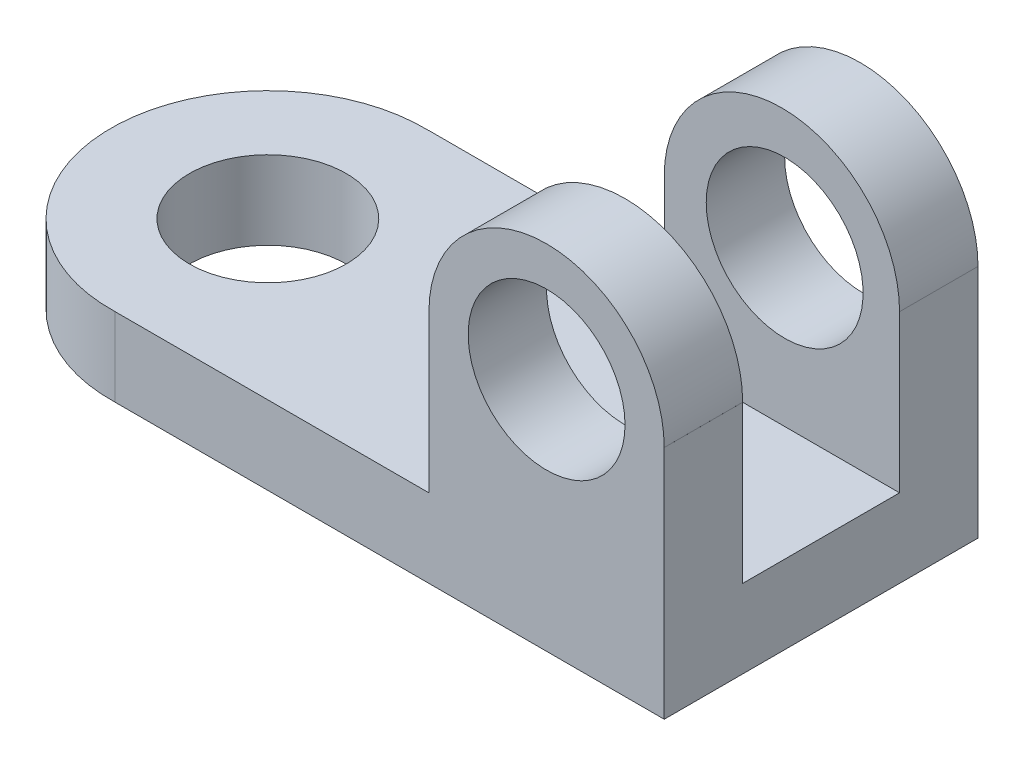
ISO-10303-21;
HEADER;
FILE_DESCRIPTION(('STEP AP214'),'2;1');
FILE_NAME('part.step','',(''),(''),'','','');
FILE_SCHEMA(('AUTOMOTIVE_DESIGN { 1 0 10303 214 1 1 1 1 }'));
ENDSEC;
DATA;
#1=APPLICATION_CONTEXT('core data for automotive mechanical design processes');
#2=APPLICATION_PROTOCOL_DEFINITION('international standard','automotive_design',2000,#1);
#3=PRODUCT_CONTEXT('',#1,'mechanical');
#4=PRODUCT('Part','Part','',(#3));
#5=PRODUCT_RELATED_PRODUCT_CATEGORY('part','',(#4));
#6=PRODUCT_DEFINITION_FORMATION('','',#4);
#7=PRODUCT_DEFINITION_CONTEXT('part definition',#1,'design');
#8=PRODUCT_DEFINITION('design','',#6,#7);
#9=PRODUCT_DEFINITION_SHAPE('','',#8);
#10=(LENGTH_UNIT() NAMED_UNIT(*) SI_UNIT(.MILLI.,.METRE.));
#11=(NAMED_UNIT(*) PLANE_ANGLE_UNIT() SI_UNIT($,.RADIAN.));
#12=(NAMED_UNIT(*) SI_UNIT($,.STERADIAN.) SOLID_ANGLE_UNIT());
#13=UNCERTAINTY_MEASURE_WITH_UNIT(LENGTH_MEASURE(1.E-05),#10,'distance_accuracy_value','');
#14=(GEOMETRIC_REPRESENTATION_CONTEXT(3) GLOBAL_UNCERTAINTY_ASSIGNED_CONTEXT((#13)) GLOBAL_UNIT_ASSIGNED_CONTEXT((#10,
#11,#12)) REPRESENTATION_CONTEXT('',''));
#15=CARTESIAN_POINT('',(0.,0.,0.));
#16=DIRECTION('',(0.,0.,1.));
#17=DIRECTION('',(1.,0.,0.));
#18=AXIS2_PLACEMENT_3D('',#15,#16,#17);
#19=CARTESIAN_POINT('',(0.,12.7,0.));
#20=DIRECTION('',(0.,0.,-1.));
#21=DIRECTION('',(-1.,0.,0.));
#22=AXIS2_PLACEMENT_3D('',#19,#20,#21);
#23=PLANE('',#22);
#24=CARTESIAN_POINT('',(-19.05,38.1,0.));
#25=DIRECTION('',(0.,0.,1.));
#26=DIRECTION('',(1.,0.,0.));
#27=AXIS2_PLACEMENT_3D('',#24,#25,#26);
#28=CIRCLE('',#27,12.7);
#29=CARTESIAN_POINT('',(-6.35000000000001,38.1,0.));
#30=VERTEX_POINT('',#29);
#31=EDGE_CURVE('E167',#30,#30,#28,.T.);
#32=ORIENTED_EDGE('',*,*,#31,.F.);
#33=EDGE_LOOP('',(#32));
#34=FACE_BOUND('',#33,.T.);
#35=DIRECTION('',(1.,0.,0.));
#36=VECTOR('',#35,1.);
#37=CARTESIAN_POINT('',(0.,0.,0.));
#38=LINE('',#37,#36);
#39=CARTESIAN_POINT('',(-88.9,0.,0.));
#40=VERTEX_POINT('',#39);
#41=CARTESIAN_POINT('',(0.,0.,0.));
#42=VERTEX_POINT('',#41);
#43=EDGE_CURVE('E207',#40,#42,#38,.T.);
#44=ORIENTED_EDGE('',*,*,#43,.T.);
#45=DIRECTION('',(0.,-1.,0.));
#46=VECTOR('',#45,1.);
#47=CARTESIAN_POINT('',(0.,12.7,0.));
#48=LINE('',#47,#46);
#49=CARTESIAN_POINT('',(0.,38.1,0.));
#50=VERTEX_POINT('',#49);
#51=EDGE_CURVE('E11',#50,#42,#48,.T.);
#52=ORIENTED_EDGE('',*,*,#51,.F.);
#53=DIRECTION('',(-1.,0.,0.));
#54=VECTOR('',#53,1.);
#55=CARTESIAN_POINT('',(-0.0026166621601674,38.1,0.));
#56=LINE('',#55,#54);
#57=CARTESIAN_POINT('',(-0.0026166621601674,38.1,0.));
#58=VERTEX_POINT('',#57);
#59=EDGE_CURVE('E173',#50,#58,#56,.T.);
#60=ORIENTED_EDGE('',*,*,#59,.T.);
#61=CARTESIAN_POINT('',(-19.05,38.1,0.));
#62=DIRECTION('',(0.,0.,1.));
#63=DIRECTION('',(1.,0.,0.));
#64=AXIS2_PLACEMENT_3D('',#61,#62,#63);
#65=CIRCLE('',#64,19.0473833378398);
#66=CARTESIAN_POINT('',(-38.0973833378399,38.1,0.));
#67=VERTEX_POINT('',#66);
#68=EDGE_CURVE('E197',#58,#67,#65,.T.);
#69=ORIENTED_EDGE('',*,*,#68,.T.);
#70=DIRECTION('',(-1.,0.,0.));
#71=VECTOR('',#70,1.);
#72=CARTESIAN_POINT('',(-38.1,38.1,0.));
#73=LINE('',#72,#71);
#74=CARTESIAN_POINT('',(-38.1,38.1,0.));
#75=VERTEX_POINT('',#74);
#76=EDGE_CURVE('E200',#67,#75,#73,.T.);
#77=ORIENTED_EDGE('',*,*,#76,.T.);
#78=DIRECTION('',(0.,-1.,0.));
#79=VECTOR('',#78,1.);
#80=CARTESIAN_POINT('',(-38.1,12.7,0.));
#81=LINE('',#80,#79);
#82=CARTESIAN_POINT('',(-38.1,12.7,0.));
#83=VERTEX_POINT('',#82);
#84=EDGE_CURVE('E179',#75,#83,#81,.T.);
#85=ORIENTED_EDGE('',*,*,#84,.T.);
#86=DIRECTION('',(1.,0.,0.));
#87=VECTOR('',#86,1.);
#88=CARTESIAN_POINT('',(0.,12.7,0.));
#89=LINE('',#88,#87);
#90=CARTESIAN_POINT('',(-88.9,12.7,0.));
#91=VERTEX_POINT('',#90);
#92=EDGE_CURVE('E216',#91,#83,#89,.T.);
#93=ORIENTED_EDGE('',*,*,#92,.F.);
#94=DIRECTION('',(0.,-1.,0.));
#95=VECTOR('',#94,1.);
#96=CARTESIAN_POINT('',(-88.9,12.7,0.));
#97=LINE('',#96,#95);
#98=EDGE_CURVE('E227',#91,#40,#97,.T.);
#99=ORIENTED_EDGE('',*,*,#98,.T.);
#100=EDGE_LOOP('',(#44,#52,#60,#69,#77,#85,#93,#99));
#101=FACE_BOUND('',#100,.T.);
#102=ADVANCED_FACE('F39',(#34,#101),#23,.F.);
#103=CARTESIAN_POINT('',(0.,12.7,0.));
#104=DIRECTION('',(-1.,0.,0.));
#105=DIRECTION('',(0.,0.,1.));
#106=AXIS2_PLACEMENT_3D('',#103,#104,#105);
#107=PLANE('',#106);
#108=DIRECTION('',(0.,0.,-1.));
#109=VECTOR('',#108,1.);
#110=CARTESIAN_POINT('',(0.,0.,0.));
#111=LINE('',#110,#109);
#112=CARTESIAN_POINT('',(0.,0.,-50.8));
#113=VERTEX_POINT('',#112);
#114=EDGE_CURVE('E230',#42,#113,#111,.T.);
#115=ORIENTED_EDGE('',*,*,#114,.T.);
#116=DIRECTION('',(0.,-1.,0.));
#117=VECTOR('',#116,1.);
#118=CARTESIAN_POINT('',(0.,12.7,-50.8));
#119=LINE('',#118,#117);
#120=CARTESIAN_POINT('',(0.,38.1,-50.8));
#121=VERTEX_POINT('',#120);
#122=EDGE_CURVE('E47',#121,#113,#119,.T.);
#123=ORIENTED_EDGE('',*,*,#122,.F.);
#124=DIRECTION('',(0.,0.,-1.));
#125=VECTOR('',#124,1.);
#126=CARTESIAN_POINT('',(0.,38.1,-38.1));
#127=LINE('',#126,#125);
#128=CARTESIAN_POINT('',(0.,38.1,-38.1));
#129=VERTEX_POINT('',#128);
#130=EDGE_CURVE('E147',#129,#121,#127,.T.);
#131=ORIENTED_EDGE('',*,*,#130,.F.);
#132=DIRECTION('',(0.,-1.,0.));
#133=VECTOR('',#132,1.);
#134=CARTESIAN_POINT('',(0.,38.1,-38.1));
#135=LINE('',#134,#133);
#136=CARTESIAN_POINT('',(0.,12.7,-38.1));
#137=VERTEX_POINT('',#136);
#138=EDGE_CURVE('E155',#129,#137,#135,.T.);
#139=ORIENTED_EDGE('',*,*,#138,.T.);
#140=DIRECTION('',(0.,0.,-1.));
#141=VECTOR('',#140,1.);
#142=CARTESIAN_POINT('',(0.,12.7,0.));
#143=LINE('',#142,#141);
#144=CARTESIAN_POINT('',(0.,12.7,-12.7));
#145=VERTEX_POINT('',#144);
#146=EDGE_CURVE('E60',#145,#137,#143,.T.);
#147=ORIENTED_EDGE('',*,*,#146,.F.);
#148=DIRECTION('',(0.,1.,0.));
#149=VECTOR('',#148,1.);
#150=CARTESIAN_POINT('',(0.,12.7,-12.7));
#151=LINE('',#150,#149);
#152=CARTESIAN_POINT('',(0.,38.1,-12.7));
#153=VERTEX_POINT('',#152);
#154=EDGE_CURVE('E178',#145,#153,#151,.T.);
#155=ORIENTED_EDGE('',*,*,#154,.T.);
#156=DIRECTION('',(0.,0.,1.));
#157=VECTOR('',#156,1.);
#158=CARTESIAN_POINT('',(0.,38.1,-12.7));
#159=LINE('',#158,#157);
#160=EDGE_CURVE('E194',#153,#50,#159,.T.);
#161=ORIENTED_EDGE('',*,*,#160,.T.);
#162=ORIENTED_EDGE('',*,*,#51,.T.);
#163=EDGE_LOOP('',(#115,#123,#131,#139,#147,#155,#161,#162));
#164=FACE_BOUND('',#163,.T.);
#165=ADVANCED_FACE('F291',(#164),#107,.F.);
#166=CARTESIAN_POINT('',(0.,12.7,-50.8));
#167=DIRECTION('',(0.,0.,1.));
#168=DIRECTION('',(1.,0.,0.));
#169=AXIS2_PLACEMENT_3D('',#166,#167,#168);
#170=PLANE('',#169);
#171=CARTESIAN_POINT('',(-18.6039944495614,37.7608160345359,-50.8));
#172=DIRECTION('',(0.,0.,-1.));
#173=DIRECTION('',(-1.,0.,0.));
#174=AXIS2_PLACEMENT_3D('',#171,#172,#173);
#175=CIRCLE('',#174,12.7);
#176=CARTESIAN_POINT('',(-31.3039944495614,37.7608160345359,-50.8));
#177=VERTEX_POINT('',#176);
#178=EDGE_CURVE('E247',#177,#177,#175,.T.);
#179=ORIENTED_EDGE('',*,*,#178,.F.);
#180=EDGE_LOOP('',(#179));
#181=FACE_BOUND('',#180,.T.);
#182=DIRECTION('',(-1.,0.,0.));
#183=VECTOR('',#182,1.);
#184=CARTESIAN_POINT('',(0.,0.,-50.8));
#185=LINE('',#184,#183);
#186=CARTESIAN_POINT('',(-88.9,0.,-50.8));
#187=VERTEX_POINT('',#186);
#188=EDGE_CURVE('E232',#113,#187,#185,.T.);
#189=ORIENTED_EDGE('',*,*,#188,.T.);
#190=DIRECTION('',(0.,-1.,0.));
#191=VECTOR('',#190,1.);
#192=CARTESIAN_POINT('',(-88.9,12.7,-50.8));
#193=LINE('',#192,#191);
#194=CARTESIAN_POINT('',(-88.9,12.7,-50.8));
#195=VERTEX_POINT('',#194);
#196=EDGE_CURVE('E242',#195,#187,#193,.T.);
#197=ORIENTED_EDGE('',*,*,#196,.F.);
#198=DIRECTION('',(-1.,0.,0.));
#199=VECTOR('',#198,1.);
#200=CARTESIAN_POINT('',(0.,12.7,-50.8));
#201=LINE('',#200,#199);
#202=CARTESIAN_POINT('',(-38.1,12.7,-50.8));
#203=VERTEX_POINT('',#202);
#204=EDGE_CURVE('E221',#203,#195,#201,.T.);
#205=ORIENTED_EDGE('',*,*,#204,.F.);
#206=DIRECTION('',(0.000103018194734845,0.999999994693626,0.));
#207=VECTOR('',#206,1.);
#208=CARTESIAN_POINT('',(-38.1,12.7,-50.8));
#209=LINE('',#208,#207);
#210=CARTESIAN_POINT('',(-38.0973833378399,38.1,-50.8));
#211=VERTEX_POINT('',#210);
#212=EDGE_CURVE('E163',#203,#211,#209,.T.);
#213=ORIENTED_EDGE('',*,*,#212,.T.);
#214=CARTESIAN_POINT('',(-19.0486916689199,38.1,-50.8));
#215=DIRECTION('',(0.,0.,-1.));
#216=DIRECTION('',(-1.,0.,0.));
#217=AXIS2_PLACEMENT_3D('',#214,#215,#216);
#218=CIRCLE('',#217,19.0486916689199);
#219=EDGE_CURVE('E142',#211,#121,#218,.T.);
#220=ORIENTED_EDGE('',*,*,#219,.T.);
#221=ORIENTED_EDGE('',*,*,#122,.T.);
#222=EDGE_LOOP('',(#189,#197,#205,#213,#220,#221));
#223=FACE_BOUND('',#222,.T.);
#224=ADVANCED_FACE('F269',(#181,#223),#170,.F.);
#225=CARTESIAN_POINT('',(-88.9,12.7,-50.8));
#226=DIRECTION('',(1.,0.,7.87699102479038E-13));
#227=DIRECTION('',(7.87699102479038E-13,0.,-1.));
#228=AXIS2_PLACEMENT_3D('',#225,#226,#227);
#229=PLANE('',#228);
#230=DIRECTION('',(-7.87699102479038E-13,0.,1.));
#231=VECTOR('',#230,1.);
#232=CARTESIAN_POINT('',(-88.9,0.,-50.8));
#233=LINE('',#232,#231);
#234=CARTESIAN_POINT('',(-88.9,0.,-50.7823818666745));
#235=VERTEX_POINT('',#234);
#236=EDGE_CURVE('E234',#187,#235,#233,.T.);
#237=ORIENTED_EDGE('',*,*,#236,.T.);
#238=DIRECTION('',(0.,-1.,0.));
#239=VECTOR('',#238,1.);
#240=CARTESIAN_POINT('',(-88.9,12.7,-50.7823818666745));
#241=LINE('',#240,#239);
#242=CARTESIAN_POINT('',(-88.9,12.7,-50.7823818666745));
#243=VERTEX_POINT('',#242);
#244=EDGE_CURVE('E239',#243,#235,#241,.T.);
#245=ORIENTED_EDGE('',*,*,#244,.F.);
#246=DIRECTION('',(-7.87699102479038E-13,0.,1.));
#247=VECTOR('',#246,1.);
#248=CARTESIAN_POINT('',(-88.9,12.7,-50.8));
#249=LINE('',#248,#247);
#250=EDGE_CURVE('E223',#195,#243,#249,.T.);
#251=ORIENTED_EDGE('',*,*,#250,.F.);
#252=ORIENTED_EDGE('',*,*,#196,.T.);
#253=EDGE_LOOP('',(#237,#245,#251,#252));
#254=FACE_BOUND('',#253,.T.);
#255=ADVANCED_FACE('F275',(#254),#229,.F.);
#256=CARTESIAN_POINT('',(-89.5688968431763,12.7,-25.3911909333373));
#257=DIRECTION('',(0.,-1.,0.));
#258=DIRECTION('',(0.,0.,-1.));
#259=AXIS2_PLACEMENT_3D('',#256,#257,#258);
#260=CYLINDRICAL_SURFACE('',#259,25.4);
#261=CARTESIAN_POINT('',(-89.5688968431763,0.,-25.3911909333373));
#262=DIRECTION('',(0.,1.,0.));
#263=DIRECTION('',(0.,0.,1.));
#264=AXIS2_PLACEMENT_3D('',#261,#262,#263);
#265=CIRCLE('',#264,25.4);
#266=EDGE_CURVE('E219',#235,#40,#265,.T.);
#267=ORIENTED_EDGE('',*,*,#266,.T.);
#268=ORIENTED_EDGE('',*,*,#98,.F.);
#269=CARTESIAN_POINT('',(-89.5688968431763,12.7,-25.3911909333373));
#270=DIRECTION('',(0.,1.,0.));
#271=DIRECTION('',(0.,0.,1.));
#272=AXIS2_PLACEMENT_3D('',#269,#270,#271);
#273=CIRCLE('',#272,25.4);
#274=EDGE_CURVE('E225',#243,#91,#273,.T.);
#275=ORIENTED_EDGE('',*,*,#274,.F.);
#276=ORIENTED_EDGE('',*,*,#244,.T.);
#277=EDGE_LOOP('',(#267,#268,#275,#276));
#278=FACE_BOUND('',#277,.T.);
#279=ADVANCED_FACE('F265',(#278),#260,.T.);
#280=CARTESIAN_POINT('',(-89.5688968431763,12.7,-25.3911909333373));
#281=DIRECTION('',(0.,1.,0.));
#282=DIRECTION('',(0.,0.,1.));
#283=AXIS2_PLACEMENT_3D('',#280,#281,#282);
#284=PLANE('',#283);
#285=CARTESIAN_POINT('',(-89.5688968431762,12.7,-25.3911909333373));
#286=DIRECTION('',(0.,1.,0.));
#287=DIRECTION('',(0.,0.,1.));
#288=AXIS2_PLACEMENT_3D('',#285,#286,#287);
#289=CIRCLE('',#288,12.7);
#290=CARTESIAN_POINT('',(-89.5688968431762,12.7,-12.6911909333373));
#291=VERTEX_POINT('',#290);
#292=EDGE_CURVE('E254',#291,#291,#289,.T.);
#293=ORIENTED_EDGE('',*,*,#292,.F.);
#294=EDGE_LOOP('',(#293));
#295=FACE_BOUND('',#294,.T.);
#296=DIRECTION('',(0.,0.,-1.));
#297=VECTOR('',#296,1.);
#298=CARTESIAN_POINT('',(-38.1,12.7,-38.1));
#299=LINE('',#298,#297);
#300=CARTESIAN_POINT('',(-38.1,12.7,-38.1));
#301=VERTEX_POINT('',#300);
#302=EDGE_CURVE('E148',#301,#203,#299,.T.);
#303=ORIENTED_EDGE('',*,*,#302,.T.);
#304=ORIENTED_EDGE('',*,*,#204,.T.);
#305=ORIENTED_EDGE('',*,*,#250,.T.);
#306=ORIENTED_EDGE('',*,*,#274,.T.);
#307=ORIENTED_EDGE('',*,*,#92,.T.);
#308=DIRECTION('',(0.,0.,1.));
#309=VECTOR('',#308,1.);
#310=CARTESIAN_POINT('',(-38.1,12.7,-12.7));
#311=LINE('',#310,#309);
#312=CARTESIAN_POINT('',(-38.1,12.7,-12.7));
#313=VERTEX_POINT('',#312);
#314=EDGE_CURVE('E205',#313,#83,#311,.T.);
#315=ORIENTED_EDGE('',*,*,#314,.F.);
#316=DIRECTION('',(1.,0.,0.));
#317=VECTOR('',#316,1.);
#318=CARTESIAN_POINT('',(-38.1,12.7,-12.7));
#319=LINE('',#318,#317);
#320=EDGE_CURVE('E176',#313,#145,#319,.T.);
#321=ORIENTED_EDGE('',*,*,#320,.T.);
#322=ORIENTED_EDGE('',*,*,#146,.T.);
#323=DIRECTION('',(-1.,0.,0.));
#324=VECTOR('',#323,1.);
#325=CARTESIAN_POINT('',(0.,12.7,-38.1));
#326=LINE('',#325,#324);
#327=EDGE_CURVE('E55',#137,#301,#326,.T.);
#328=ORIENTED_EDGE('',*,*,#327,.T.);
#329=EDGE_LOOP('',(#303,#304,#305,#306,#307,#315,#321,#322,#328));
#330=FACE_BOUND('',#329,.T.);
#331=ADVANCED_FACE('F262',(#295,#330),#284,.T.);
#332=CARTESIAN_POINT('',(-89.5688968431763,0.,-25.3911909333373));
#333=DIRECTION('',(0.,1.,0.));
#334=DIRECTION('',(0.,0.,1.));
#335=AXIS2_PLACEMENT_3D('',#332,#333,#334);
#336=PLANE('',#335);
#337=CARTESIAN_POINT('',(-89.5688968431762,0.,-25.3911909333373));
#338=DIRECTION('',(0.,1.,0.));
#339=DIRECTION('',(0.,0.,1.));
#340=AXIS2_PLACEMENT_3D('',#337,#338,#339);
#341=CIRCLE('',#340,12.7);
#342=CARTESIAN_POINT('',(-89.5688968431762,0.,-12.6911909333373));
#343=VERTEX_POINT('',#342);
#344=EDGE_CURVE('E42',#343,#343,#341,.T.);
#345=ORIENTED_EDGE('',*,*,#344,.T.);
#346=EDGE_LOOP('',(#345));
#347=FACE_BOUND('',#346,.T.);
#348=ORIENTED_EDGE('',*,*,#43,.F.);
#349=ORIENTED_EDGE('',*,*,#266,.F.);
#350=ORIENTED_EDGE('',*,*,#236,.F.);
#351=ORIENTED_EDGE('',*,*,#188,.F.);
#352=ORIENTED_EDGE('',*,*,#114,.F.);
#353=EDGE_LOOP('',(#348,#349,#350,#351,#352));
#354=FACE_BOUND('',#353,.T.);
#355=ADVANCED_FACE('F264',(#347,#354),#336,.F.);
#356=CARTESIAN_POINT('',(-38.1,12.7,-12.7));
#357=DIRECTION('',(-1.,0.,0.));
#358=DIRECTION('',(0.,0.,1.));
#359=AXIS2_PLACEMENT_3D('',#356,#357,#358);
#360=PLANE('',#359);
#361=ORIENTED_EDGE('',*,*,#84,.F.);
#362=DIRECTION('',(0.,0.,1.));
#363=VECTOR('',#362,1.);
#364=CARTESIAN_POINT('',(-38.1,38.1,-12.7));
#365=LINE('',#364,#363);
#366=CARTESIAN_POINT('',(-38.1,38.1,-12.7));
#367=VERTEX_POINT('',#366);
#368=EDGE_CURVE('E208',#367,#75,#365,.T.);
#369=ORIENTED_EDGE('',*,*,#368,.F.);
#370=DIRECTION('',(0.,-1.,0.));
#371=VECTOR('',#370,1.);
#372=CARTESIAN_POINT('',(-38.1,12.7,-12.7));
#373=LINE('',#372,#371);
#374=EDGE_CURVE('E191',#367,#313,#373,.T.);
#375=ORIENTED_EDGE('',*,*,#374,.T.);
#376=ORIENTED_EDGE('',*,*,#314,.T.);
#377=EDGE_LOOP('',(#361,#369,#375,#376));
#378=FACE_BOUND('',#377,.T.);
#379=ADVANCED_FACE('F287',(#378),#360,.T.);
#380=CARTESIAN_POINT('',(-38.1,38.1,-12.7));
#381=DIRECTION('',(0.,1.,0.));
#382=DIRECTION('',(0.,0.,1.));
#383=AXIS2_PLACEMENT_3D('',#380,#381,#382);
#384=PLANE('',#383);
#385=ORIENTED_EDGE('',*,*,#76,.F.);
#386=DIRECTION('',(0.,0.,1.));
#387=VECTOR('',#386,1.);
#388=CARTESIAN_POINT('',(-38.0973833378399,38.1,-12.7));
#389=LINE('',#388,#387);
#390=CARTESIAN_POINT('',(-38.0973833378399,38.1,-12.7));
#391=VERTEX_POINT('',#390);
#392=EDGE_CURVE('E210',#391,#67,#389,.T.);
#393=ORIENTED_EDGE('',*,*,#392,.F.);
#394=DIRECTION('',(-1.,0.,0.));
#395=VECTOR('',#394,1.);
#396=CARTESIAN_POINT('',(-38.1,38.1,-12.7));
#397=LINE('',#396,#395);
#398=EDGE_CURVE('E188',#391,#367,#397,.T.);
#399=ORIENTED_EDGE('',*,*,#398,.T.);
#400=ORIENTED_EDGE('',*,*,#368,.T.);
#401=EDGE_LOOP('',(#385,#393,#399,#400));
#402=FACE_BOUND('',#401,.T.);
#403=ADVANCED_FACE('F303',(#402),#384,.T.);
#404=CARTESIAN_POINT('',(-19.05,38.1,-12.7));
#405=DIRECTION('',(0.,0.,1.));
#406=DIRECTION('',(1.,0.,0.));
#407=AXIS2_PLACEMENT_3D('',#404,#405,#406);
#408=CYLINDRICAL_SURFACE('',#407,19.0473833378398);
#409=ORIENTED_EDGE('',*,*,#68,.F.);
#410=DIRECTION('',(0.,0.,1.));
#411=VECTOR('',#410,1.);
#412=CARTESIAN_POINT('',(-0.0026166621601674,38.1,-12.7));
#413=LINE('',#412,#411);
#414=CARTESIAN_POINT('',(-0.0026166621601674,38.1,-12.7));
#415=VERTEX_POINT('',#414);
#416=EDGE_CURVE('E212',#415,#58,#413,.T.);
#417=ORIENTED_EDGE('',*,*,#416,.F.);
#418=CARTESIAN_POINT('',(-19.05,38.1,-12.7));
#419=DIRECTION('',(0.,0.,1.));
#420=DIRECTION('',(1.,0.,0.));
#421=AXIS2_PLACEMENT_3D('',#418,#419,#420);
#422=CIRCLE('',#421,19.0473833378398);
#423=EDGE_CURVE('E185',#415,#391,#422,.T.);
#424=ORIENTED_EDGE('',*,*,#423,.T.);
#425=ORIENTED_EDGE('',*,*,#392,.T.);
#426=EDGE_LOOP('',(#409,#417,#424,#425));
#427=FACE_BOUND('',#426,.T.);
#428=ADVANCED_FACE('F300',(#427),#408,.T.);
#429=CARTESIAN_POINT('',(-0.0026166621601674,38.1,-12.7));
#430=DIRECTION('',(0.,1.,0.));
#431=DIRECTION('',(0.,0.,1.));
#432=AXIS2_PLACEMENT_3D('',#429,#430,#431);
#433=PLANE('',#432);
#434=ORIENTED_EDGE('',*,*,#59,.F.);
#435=ORIENTED_EDGE('',*,*,#160,.F.);
#436=DIRECTION('',(-1.,0.,0.));
#437=VECTOR('',#436,1.);
#438=CARTESIAN_POINT('',(-0.0026166621601674,38.1,-12.7));
#439=LINE('',#438,#437);
#440=EDGE_CURVE('E182',#153,#415,#439,.T.);
#441=ORIENTED_EDGE('',*,*,#440,.T.);
#442=ORIENTED_EDGE('',*,*,#416,.T.);
#443=EDGE_LOOP('',(#434,#435,#441,#442));
#444=FACE_BOUND('',#443,.T.);
#445=ADVANCED_FACE('F296',(#444),#433,.T.);
#446=CARTESIAN_POINT('',(-19.05,38.1,-12.7));
#447=DIRECTION('',(0.,0.,1.));
#448=DIRECTION('',(1.,0.,0.));
#449=AXIS2_PLACEMENT_3D('',#446,#447,#448);
#450=PLANE('',#449);
#451=CARTESIAN_POINT('',(-19.05,38.1,-12.7));
#452=DIRECTION('',(0.,0.,1.));
#453=DIRECTION('',(1.,0.,0.));
#454=AXIS2_PLACEMENT_3D('',#451,#452,#453);
#455=CIRCLE('',#454,12.7);
#456=CARTESIAN_POINT('',(-6.35000000000001,38.1,-12.7));
#457=VERTEX_POINT('',#456);
#458=EDGE_CURVE('E170',#457,#457,#455,.T.);
#459=ORIENTED_EDGE('',*,*,#458,.T.);
#460=EDGE_LOOP('',(#459));
#461=FACE_BOUND('',#460,.T.);
#462=ORIENTED_EDGE('',*,*,#320,.F.);
#463=ORIENTED_EDGE('',*,*,#374,.F.);
#464=ORIENTED_EDGE('',*,*,#398,.F.);
#465=ORIENTED_EDGE('',*,*,#423,.F.);
#466=ORIENTED_EDGE('',*,*,#440,.F.);
#467=ORIENTED_EDGE('',*,*,#154,.F.);
#468=EDGE_LOOP('',(#462,#463,#464,#465,#466,#467));
#469=FACE_BOUND('',#468,.T.);
#470=ADVANCED_FACE('F304',(#461,#469),#450,.F.);
#471=CARTESIAN_POINT('',(-19.05,38.1,-12.7));
#472=DIRECTION('',(0.,0.,1.));
#473=DIRECTION('',(1.,0.,0.));
#474=AXIS2_PLACEMENT_3D('',#471,#472,#473);
#475=CYLINDRICAL_SURFACE('',#474,12.7);
#476=ORIENTED_EDGE('',*,*,#458,.F.);
#477=EDGE_LOOP('',(#476));
#478=FACE_BOUND('',#477,.T.);
#479=ORIENTED_EDGE('',*,*,#31,.T.);
#480=EDGE_LOOP('',(#479));
#481=FACE_BOUND('',#480,.T.);
#482=ADVANCED_FACE('F306',(#478,#481),#475,.F.);
#483=CARTESIAN_POINT('',(-19.0486916689199,38.1,-38.1));
#484=DIRECTION('',(0.,0.,-1.));
#485=DIRECTION('',(-1.,0.,0.));
#486=AXIS2_PLACEMENT_3D('',#483,#484,#485);
#487=CYLINDRICAL_SURFACE('',#486,19.0486916689199);
#488=ORIENTED_EDGE('',*,*,#219,.F.);
#489=DIRECTION('',(0.,0.,-1.));
#490=VECTOR('',#489,1.);
#491=CARTESIAN_POINT('',(-38.0973833378399,38.1,-38.1));
#492=LINE('',#491,#490);
#493=CARTESIAN_POINT('',(-38.0973833378399,38.1,-38.1));
#494=VERTEX_POINT('',#493);
#495=EDGE_CURVE('E135',#494,#211,#492,.T.);
#496=ORIENTED_EDGE('',*,*,#495,.F.);
#497=CARTESIAN_POINT('',(-19.0486916689199,38.1,-38.1));
#498=DIRECTION('',(0.,0.,-1.));
#499=DIRECTION('',(-1.,0.,0.));
#500=AXIS2_PLACEMENT_3D('',#497,#498,#499);
#501=CIRCLE('',#500,19.0486916689199);
#502=EDGE_CURVE('E139',#494,#129,#501,.T.);
#503=ORIENTED_EDGE('',*,*,#502,.T.);
#504=ORIENTED_EDGE('',*,*,#130,.T.);
#505=EDGE_LOOP('',(#488,#496,#503,#504));
#506=FACE_BOUND('',#505,.T.);
#507=ADVANCED_FACE('F137',(#506),#487,.T.);
#508=CARTESIAN_POINT('',(-38.1,12.7,-38.1));
#509=DIRECTION('',(-0.999999994693626,0.000103018194734845,0.));
#510=DIRECTION('',(-0.000103018194734845,-0.999999994693626,0.));
#511=AXIS2_PLACEMENT_3D('',#508,#509,#510);
#512=PLANE('',#511);
#513=ORIENTED_EDGE('',*,*,#212,.F.);
#514=ORIENTED_EDGE('',*,*,#302,.F.);
#515=DIRECTION('',(0.000103018194734845,0.999999994693626,0.));
#516=VECTOR('',#515,1.);
#517=CARTESIAN_POINT('',(-38.1,12.7,-38.1));
#518=LINE('',#517,#516);
#519=EDGE_CURVE('E153',#301,#494,#518,.T.);
#520=ORIENTED_EDGE('',*,*,#519,.T.);
#521=ORIENTED_EDGE('',*,*,#495,.T.);
#522=EDGE_LOOP('',(#513,#514,#520,#521));
#523=FACE_BOUND('',#522,.T.);
#524=ADVANCED_FACE('F157',(#523),#512,.T.);
#525=CARTESIAN_POINT('',(-19.0486916689199,38.1,-38.1));
#526=DIRECTION('',(0.,0.,-1.));
#527=DIRECTION('',(-1.,0.,0.));
#528=AXIS2_PLACEMENT_3D('',#525,#526,#527);
#529=PLANE('',#528);
#530=CARTESIAN_POINT('',(-18.6039944495614,37.7608160345359,-38.1));
#531=DIRECTION('',(0.,0.,-1.));
#532=DIRECTION('',(-1.,0.,0.));
#533=AXIS2_PLACEMENT_3D('',#530,#531,#532);
#534=CIRCLE('',#533,12.7);
#535=CARTESIAN_POINT('',(-31.3039944495614,37.7608160345359,-38.1));
#536=VERTEX_POINT('',#535);
#537=EDGE_CURVE('E165',#536,#536,#534,.T.);
#538=ORIENTED_EDGE('',*,*,#537,.T.);
#539=EDGE_LOOP('',(#538));
#540=FACE_BOUND('',#539,.T.);
#541=ORIENTED_EDGE('',*,*,#327,.F.);
#542=ORIENTED_EDGE('',*,*,#138,.F.);
#543=ORIENTED_EDGE('',*,*,#502,.F.);
#544=ORIENTED_EDGE('',*,*,#519,.F.);
#545=EDGE_LOOP('',(#541,#542,#543,#544));
#546=FACE_BOUND('',#545,.T.);
#547=ADVANCED_FACE('F152',(#540,#546),#529,.F.);
#548=CARTESIAN_POINT('',(-18.6039944495614,37.7608160345359,-22.098));
#549=DIRECTION('',(0.,0.,-1.));
#550=DIRECTION('',(-1.,0.,0.));
#551=AXIS2_PLACEMENT_3D('',#548,#549,#550);
#552=CYLINDRICAL_SURFACE('',#551,12.7);
#553=ORIENTED_EDGE('',*,*,#178,.T.);
#554=EDGE_LOOP('',(#553));
#555=FACE_BOUND('',#554,.T.);
#556=ORIENTED_EDGE('',*,*,#537,.F.);
#557=EDGE_LOOP('',(#556));
#558=FACE_BOUND('',#557,.T.);
#559=ADVANCED_FACE('F411',(#555,#558),#552,.F.);
#560=CARTESIAN_POINT('',(-89.5688968431762,-19.304,-25.3911909333373));
#561=DIRECTION('',(0.,1.,0.));
#562=DIRECTION('',(0.,0.,1.));
#563=AXIS2_PLACEMENT_3D('',#560,#561,#562);
#564=CYLINDRICAL_SURFACE('',#563,12.7);
#565=ORIENTED_EDGE('',*,*,#292,.T.);
#566=EDGE_LOOP('',(#565));
#567=FACE_BOUND('',#566,.T.);
#568=ORIENTED_EDGE('',*,*,#344,.F.);
#569=EDGE_LOOP('',(#568));
#570=FACE_BOUND('',#569,.T.);
#571=ADVANCED_FACE('F259',(#567,#570),#564,.F.);
#572=CLOSED_SHELL('',(#102,#165,#224,#255,#279,#331,#355,#379,#403,#428,#445,#470,#482,#507,
#524,#547,#559,#571));
#573=MANIFOLD_SOLID_BREP('B2',#572);
#574=ADVANCED_BREP_SHAPE_REPRESENTATION('',(#18,#573),#14);
#575=SHAPE_DEFINITION_REPRESENTATION(#9,#574);
ENDSEC;
END-ISO-10303-21;
